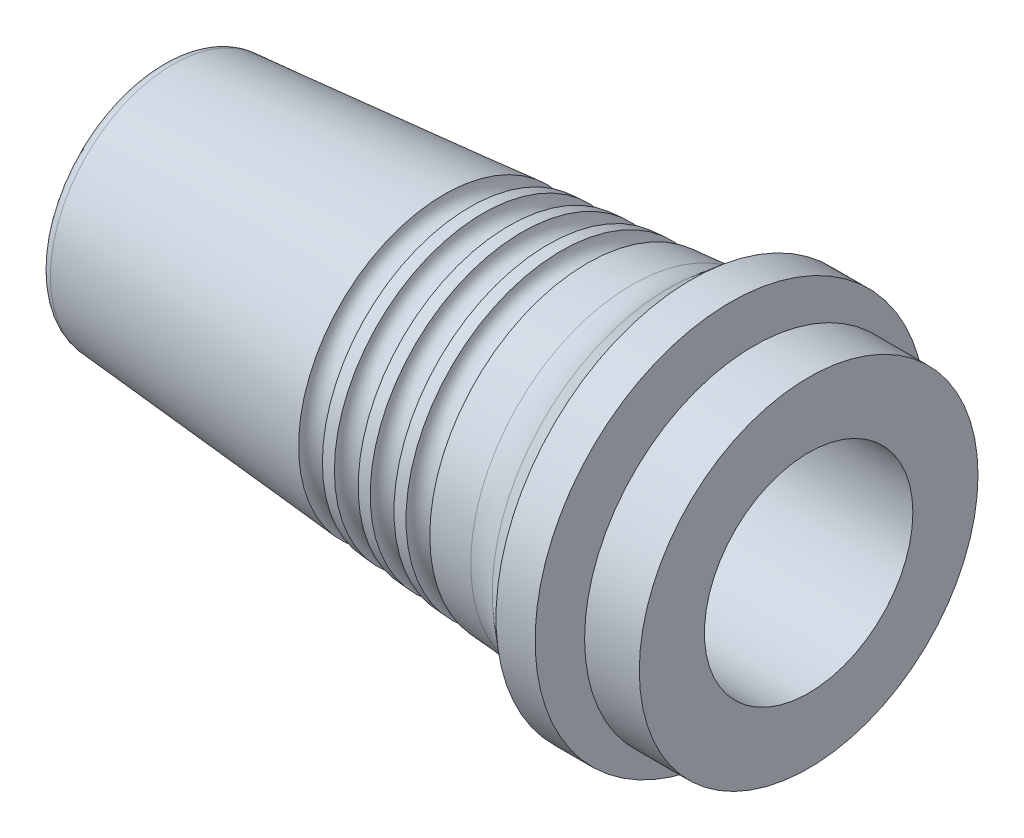
ISO-10303-21;
HEADER;
FILE_DESCRIPTION(('STEP AP214'),'2;1');
FILE_NAME('part.step','',(''),(''),'','','');
FILE_SCHEMA(('AUTOMOTIVE_DESIGN { 1 0 10303 214 1 1 1 1 }'));
ENDSEC;
DATA;
#1=APPLICATION_CONTEXT('core data for automotive mechanical design processes');
#2=APPLICATION_PROTOCOL_DEFINITION('international standard','automotive_design',2000,#1);
#3=PRODUCT_CONTEXT('',#1,'mechanical');
#4=PRODUCT('Part','Part','',(#3));
#5=PRODUCT_RELATED_PRODUCT_CATEGORY('part','',(#4));
#6=PRODUCT_DEFINITION_FORMATION('','',#4);
#7=PRODUCT_DEFINITION_CONTEXT('part definition',#1,'design');
#8=PRODUCT_DEFINITION('design','',#6,#7);
#9=PRODUCT_DEFINITION_SHAPE('','',#8);
#10=(LENGTH_UNIT() NAMED_UNIT(*) SI_UNIT(.MILLI.,.METRE.));
#11=(NAMED_UNIT(*) PLANE_ANGLE_UNIT() SI_UNIT($,.RADIAN.));
#12=(NAMED_UNIT(*) SI_UNIT($,.STERADIAN.) SOLID_ANGLE_UNIT());
#13=UNCERTAINTY_MEASURE_WITH_UNIT(LENGTH_MEASURE(1.E-05),#10,'distance_accuracy_value','');
#14=(GEOMETRIC_REPRESENTATION_CONTEXT(3) GLOBAL_UNCERTAINTY_ASSIGNED_CONTEXT((#13)) GLOBAL_UNIT_ASSIGNED_CONTEXT((#10,
#11,#12)) REPRESENTATION_CONTEXT('',''));
#15=CARTESIAN_POINT('',(0.,0.,0.));
#16=DIRECTION('',(0.,0.,1.));
#17=DIRECTION('',(1.,0.,0.));
#18=AXIS2_PLACEMENT_3D('',#15,#16,#17);
#19=CARTESIAN_POINT('',(-24.3783295478221,0.,0.));
#20=DIRECTION('',(1.,0.,0.));
#21=DIRECTION('',(0.,0.,-1.));
#22=AXIS2_PLACEMENT_3D('',#19,#20,#21);
#23=CONICAL_SURFACE('',#22,9.36511019661009,1.14346128624966);
#24=CARTESIAN_POINT('',(-24.6211020479349,0.,0.));
#25=DIRECTION('',(-1.,0.,0.));
#26=DIRECTION('',(0.,0.,1.));
#27=AXIS2_PLACEMENT_3D('',#24,#25,#26);
#28=CIRCLE('',#27,8.83201229208599);
#29=CARTESIAN_POINT('',(-24.6211020479349,0.,8.83201229208599));
#30=VERTEX_POINT('',#29);
#31=EDGE_CURVE('E48',#30,#30,#28,.T.);
#32=ORIENTED_EDGE('',*,*,#31,.T.);
#33=EDGE_LOOP('',(#32));
#34=FACE_BOUND('',#33,.T.);
#35=CARTESIAN_POINT('',(-25.,0.,0.));
#36=DIRECTION('',(1.,0.,0.));
#37=DIRECTION('',(0.,0.,-1.));
#38=AXIS2_PLACEMENT_3D('',#35,#36,#37);
#39=CIRCLE('',#38,7.99999999999999);
#40=CARTESIAN_POINT('',(-25.,0.,-7.99999999999999));
#41=VERTEX_POINT('',#40);
#42=EDGE_CURVE('E57',#41,#41,#39,.T.);
#43=ORIENTED_EDGE('',*,*,#42,.T.);
#44=EDGE_LOOP('',(#43));
#45=FACE_BOUND('',#44,.T.);
#46=ADVANCED_FACE('F37',(#34,#45),#23,.T.);
#47=CARTESIAN_POINT('',(44.8671328671328,0.,0.));
#48=DIRECTION('',(1.,0.,0.));
#49=DIRECTION('',(0.,0.,-1.));
#50=AXIS2_PLACEMENT_3D('',#47,#48,#49);
#51=CYLINDRICAL_SURFACE('',#50,7.99999999999999);
#52=CARTESIAN_POINT('',(25.,0.,0.));
#53=DIRECTION('',(1.,0.,0.));
#54=DIRECTION('',(0.,0.,-1.));
#55=AXIS2_PLACEMENT_3D('',#52,#53,#54);
#56=CIRCLE('',#55,8.);
#57=CARTESIAN_POINT('',(25.,0.,-8.));
#58=VERTEX_POINT('',#57);
#59=EDGE_CURVE('E60',#58,#58,#56,.T.);
#60=ORIENTED_EDGE('',*,*,#59,.T.);
#61=EDGE_LOOP('',(#60));
#62=FACE_BOUND('',#61,.T.);
#63=ORIENTED_EDGE('',*,*,#42,.F.);
#64=EDGE_LOOP('',(#63));
#65=FACE_BOUND('',#64,.T.);
#66=ADVANCED_FACE('F122',(#62,#65),#51,.F.);
#67=CARTESIAN_POINT('',(25.,13.,0.));
#68=DIRECTION('',(1.,0.,0.));
#69=DIRECTION('',(0.,0.,-1.));
#70=AXIS2_PLACEMENT_3D('',#67,#68,#69);
#71=PLANE('',#70);
#72=CARTESIAN_POINT('',(25.,0.,0.));
#73=DIRECTION('',(1.,0.,0.));
#74=DIRECTION('',(0.,0.,-1.));
#75=AXIS2_PLACEMENT_3D('',#72,#73,#74);
#76=CIRCLE('',#75,13.);
#77=CARTESIAN_POINT('',(25.,0.,-13.));
#78=VERTEX_POINT('',#77);
#79=EDGE_CURVE('E63',#78,#78,#76,.T.);
#80=ORIENTED_EDGE('',*,*,#79,.T.);
#81=EDGE_LOOP('',(#80));
#82=FACE_BOUND('',#81,.T.);
#83=ORIENTED_EDGE('',*,*,#59,.F.);
#84=EDGE_LOOP('',(#83));
#85=FACE_BOUND('',#84,.T.);
#86=ADVANCED_FACE('F128',(#82,#85),#71,.T.);
#87=CARTESIAN_POINT('',(44.8671328671328,0.,0.));
#88=DIRECTION('',(1.,0.,0.));
#89=DIRECTION('',(0.,0.,-1.));
#90=AXIS2_PLACEMENT_3D('',#87,#88,#89);
#91=CYLINDRICAL_SURFACE('',#90,13.);
#92=CARTESIAN_POINT('',(20.8,0.,0.));
#93=DIRECTION('',(1.,0.,0.));
#94=DIRECTION('',(0.,0.,-1.));
#95=AXIS2_PLACEMENT_3D('',#92,#93,#94);
#96=CIRCLE('',#95,13.);
#97=CARTESIAN_POINT('',(20.8,0.,-13.));
#98=VERTEX_POINT('',#97);
#99=EDGE_CURVE('E66',#98,#98,#96,.T.);
#100=ORIENTED_EDGE('',*,*,#99,.T.);
#101=EDGE_LOOP('',(#100));
#102=FACE_BOUND('',#101,.T.);
#103=ORIENTED_EDGE('',*,*,#79,.F.);
#104=EDGE_LOOP('',(#103));
#105=FACE_BOUND('',#104,.T.);
#106=ADVANCED_FACE('F135',(#102,#105),#91,.T.);
#107=CARTESIAN_POINT('',(20.8,10.,0.));
#108=DIRECTION('',(-1.,0.,0.));
#109=DIRECTION('',(0.,0.,1.));
#110=AXIS2_PLACEMENT_3D('',#107,#108,#109);
#111=PLANE('',#110);
#112=CARTESIAN_POINT('',(20.8,0.,0.));
#113=DIRECTION('',(1.,0.,0.));
#114=DIRECTION('',(0.,0.,-1.));
#115=AXIS2_PLACEMENT_3D('',#112,#113,#114);
#116=CIRCLE('',#115,10.);
#117=CARTESIAN_POINT('',(20.8,0.,-10.));
#118=VERTEX_POINT('',#117);
#119=EDGE_CURVE('E69',#118,#118,#116,.T.);
#120=ORIENTED_EDGE('',*,*,#119,.T.);
#121=EDGE_LOOP('',(#120));
#122=FACE_BOUND('',#121,.T.);
#123=ORIENTED_EDGE('',*,*,#99,.F.);
#124=EDGE_LOOP('',(#123));
#125=FACE_BOUND('',#124,.T.);
#126=ADVANCED_FACE('F139',(#122,#125),#111,.T.);
#127=CARTESIAN_POINT('',(44.8671328671328,0.,0.));
#128=DIRECTION('',(1.,0.,0.));
#129=DIRECTION('',(0.,0.,-1.));
#130=AXIS2_PLACEMENT_3D('',#127,#128,#129);
#131=CYLINDRICAL_SURFACE('',#130,10.);
#132=CARTESIAN_POINT('',(19.,0.,0.));
#133=DIRECTION('',(1.,0.,0.));
#134=DIRECTION('',(0.,0.,-1.));
#135=AXIS2_PLACEMENT_3D('',#132,#133,#134);
#136=CIRCLE('',#135,10.);
#137=CARTESIAN_POINT('',(19.,0.,-10.));
#138=VERTEX_POINT('',#137);
#139=EDGE_CURVE('E72',#138,#138,#136,.T.);
#140=ORIENTED_EDGE('',*,*,#139,.T.);
#141=EDGE_LOOP('',(#140));
#142=FACE_BOUND('',#141,.T.);
#143=ORIENTED_EDGE('',*,*,#119,.F.);
#144=EDGE_LOOP('',(#143));
#145=FACE_BOUND('',#144,.T.);
#146=ADVANCED_FACE('F143',(#142,#145),#131,.T.);
#147=CARTESIAN_POINT('',(19.,15.,0.));
#148=DIRECTION('',(1.,0.,0.));
#149=DIRECTION('',(0.,0.,-1.));
#150=AXIS2_PLACEMENT_3D('',#147,#148,#149);
#151=PLANE('',#150);
#152=CARTESIAN_POINT('',(19.,0.,0.));
#153=DIRECTION('',(1.,0.,0.));
#154=DIRECTION('',(0.,0.,-1.));
#155=AXIS2_PLACEMENT_3D('',#152,#153,#154);
#156=CIRCLE('',#155,15.);
#157=CARTESIAN_POINT('',(19.,0.,-15.));
#158=VERTEX_POINT('',#157);
#159=EDGE_CURVE('E75',#158,#158,#156,.T.);
#160=ORIENTED_EDGE('',*,*,#159,.T.);
#161=EDGE_LOOP('',(#160));
#162=FACE_BOUND('',#161,.T.);
#163=ORIENTED_EDGE('',*,*,#139,.F.);
#164=EDGE_LOOP('',(#163));
#165=FACE_BOUND('',#164,.T.);
#166=ADVANCED_FACE('F147',(#162,#165),#151,.T.);
#167=CARTESIAN_POINT('',(44.8671328671328,0.,0.));
#168=DIRECTION('',(1.,0.,0.));
#169=DIRECTION('',(0.,0.,-1.));
#170=AXIS2_PLACEMENT_3D('',#167,#168,#169);
#171=CYLINDRICAL_SURFACE('',#170,15.);
#172=CARTESIAN_POINT('',(16.,0.,0.));
#173=DIRECTION('',(1.,0.,0.));
#174=DIRECTION('',(0.,0.,-1.));
#175=AXIS2_PLACEMENT_3D('',#172,#173,#174);
#176=CIRCLE('',#175,15.);
#177=CARTESIAN_POINT('',(16.,0.,-15.));
#178=VERTEX_POINT('',#177);
#179=EDGE_CURVE('E78',#178,#178,#176,.T.);
#180=ORIENTED_EDGE('',*,*,#179,.T.);
#181=EDGE_LOOP('',(#180));
#182=FACE_BOUND('',#181,.T.);
#183=ORIENTED_EDGE('',*,*,#159,.F.);
#184=EDGE_LOOP('',(#183));
#185=FACE_BOUND('',#184,.T.);
#186=ADVANCED_FACE('F151',(#182,#185),#171,.T.);
#187=CARTESIAN_POINT('',(16.,0.,0.));
#188=DIRECTION('',(1.,0.,0.));
#189=DIRECTION('',(0.,0.,-1.));
#190=AXIS2_PLACEMENT_3D('',#187,#188,#189);
#191=CONICAL_SURFACE('',#190,15.,0.694738276196703);
#192=CARTESIAN_POINT('',(14.211517828766,0.,0.));
#193=DIRECTION('',(1.,0.,0.));
#194=DIRECTION('',(0.,0.,-1.));
#195=AXIS2_PLACEMENT_3D('',#192,#193,#194);
#196=CIRCLE('',#195,13.5095981906383);
#197=CARTESIAN_POINT('',(14.211517828766,0.,-13.5095981906383));
#198=VERTEX_POINT('',#197);
#199=EDGE_CURVE('E44',#198,#198,#196,.T.);
#200=ORIENTED_EDGE('',*,*,#199,.T.);
#201=EDGE_LOOP('',(#200));
#202=FACE_BOUND('',#201,.T.);
#203=ORIENTED_EDGE('',*,*,#179,.F.);
#204=EDGE_LOOP('',(#203));
#205=FACE_BOUND('',#204,.T.);
#206=ADVANCED_FACE('F155',(#202,#205),#191,.T.);
#207=CARTESIAN_POINT('',(13.,0.,0.));
#208=DIRECTION('',(1.,0.,0.));
#209=DIRECTION('',(0.,0.,-1.));
#210=AXIS2_PLACEMENT_3D('',#207,#208,#209);
#211=CONICAL_SURFACE('',#210,12.5,0.0836733582026755);
#212=CARTESIAN_POINT('',(11.4284746119061,0.,0.));
#213=DIRECTION('',(1.,0.,0.));
#214=DIRECTION('',(0.,0.,-1.));
#215=AXIS2_PLACEMENT_3D('',#212,#213,#214);
#216=CIRCLE('',#215,12.3681974562667);
#217=CARTESIAN_POINT('',(11.4284746119061,0.,-12.3681974562667));
#218=VERTEX_POINT('',#217);
#219=EDGE_CURVE('E10',#218,#218,#216,.F.);
#220=ORIENTED_EDGE('',*,*,#219,.T.);
#221=EDGE_LOOP('',(#220));
#222=FACE_BOUND('',#221,.T.);
#223=CARTESIAN_POINT('',(7.9965014264717,0.,0.));
#224=DIRECTION('',(1.,0.,0.));
#225=DIRECTION('',(0.,0.,-1.));
#226=AXIS2_PLACEMENT_3D('',#223,#224,#225);
#227=CIRCLE('',#226,12.0803606836051);
#228=CARTESIAN_POINT('',(7.9965014264717,0.,-12.0803606836051));
#229=VERTEX_POINT('',#228);
#230=EDGE_CURVE('E81',#229,#229,#227,.T.);
#231=ORIENTED_EDGE('',*,*,#230,.T.);
#232=EDGE_LOOP('',(#231));
#233=FACE_BOUND('',#232,.T.);
#234=ADVANCED_FACE('F159',(#222,#233),#211,.T.);
#235=CARTESIAN_POINT('',(7.,0.,0.));
#236=DIRECTION('',(1.,0.,0.));
#237=DIRECTION('',(0.,0.,-1.));
#238=AXIS2_PLACEMENT_3D('',#235,#236,#237);
#239=TOROIDAL_SURFACE('',#238,11.9967849273126,1.);
#240=CARTESIAN_POINT('',(6.0034985735283,0.,0.));
#241=DIRECTION('',(1.,0.,0.));
#242=DIRECTION('',(0.,0.,-1.));
#243=AXIS2_PLACEMENT_3D('',#240,#241,#242);
#244=CIRCLE('',#243,11.9132091710201);
#245=CARTESIAN_POINT('',(6.0034985735283,0.,-11.9132091710201));
#246=VERTEX_POINT('',#245);
#247=EDGE_CURVE('E84',#246,#246,#244,.T.);
#248=ORIENTED_EDGE('',*,*,#247,.T.);
#249=EDGE_LOOP('',(#248));
#250=FACE_BOUND('',#249,.T.);
#251=ORIENTED_EDGE('',*,*,#230,.F.);
#252=EDGE_LOOP('',(#251));
#253=FACE_BOUND('',#252,.T.);
#254=ADVANCED_FACE('F162',(#250,#253),#239,.F.);
#255=CARTESIAN_POINT('',(6.0034985735283,0.,0.));
#256=DIRECTION('',(1.,0.,0.));
#257=DIRECTION('',(0.,0.,-1.));
#258=AXIS2_PLACEMENT_3D('',#255,#256,#257);
#259=CONICAL_SURFACE('',#258,11.9132091710201,0.0836733582026758);
#260=CARTESIAN_POINT('',(4.99650142647171,0.,0.));
#261=DIRECTION('',(1.,0.,0.));
#262=DIRECTION('',(0.,0.,-1.));
#263=AXIS2_PLACEMENT_3D('',#260,#261,#262);
#264=CIRCLE('',#263,11.8287531472615);
#265=CARTESIAN_POINT('',(4.99650142647171,0.,-11.8287531472615));
#266=VERTEX_POINT('',#265);
#267=EDGE_CURVE('E87',#266,#266,#264,.T.);
#268=ORIENTED_EDGE('',*,*,#267,.T.);
#269=EDGE_LOOP('',(#268));
#270=FACE_BOUND('',#269,.T.);
#271=ORIENTED_EDGE('',*,*,#247,.F.);
#272=EDGE_LOOP('',(#271));
#273=FACE_BOUND('',#272,.T.);
#274=ADVANCED_FACE('F165',(#270,#273),#259,.T.);
#275=CARTESIAN_POINT('',(4.,0.,0.));
#276=DIRECTION('',(1.,0.,0.));
#277=DIRECTION('',(0.,0.,-1.));
#278=AXIS2_PLACEMENT_3D('',#275,#276,#277);
#279=TOROIDAL_SURFACE('',#278,11.745177390969,1.);
#280=CARTESIAN_POINT('',(3.0034985735283,0.,0.));
#281=DIRECTION('',(1.,0.,0.));
#282=DIRECTION('',(0.,0.,-1.));
#283=AXIS2_PLACEMENT_3D('',#280,#281,#282);
#284=CIRCLE('',#283,11.6616016346765);
#285=CARTESIAN_POINT('',(3.0034985735283,0.,-11.6616016346765));
#286=VERTEX_POINT('',#285);
#287=EDGE_CURVE('E90',#286,#286,#284,.T.);
#288=ORIENTED_EDGE('',*,*,#287,.T.);
#289=EDGE_LOOP('',(#288));
#290=FACE_BOUND('',#289,.T.);
#291=ORIENTED_EDGE('',*,*,#267,.F.);
#292=EDGE_LOOP('',(#291));
#293=FACE_BOUND('',#292,.T.);
#294=ADVANCED_FACE('F169',(#290,#293),#279,.F.);
#295=CARTESIAN_POINT('',(3.0034985735283,0.,0.));
#296=DIRECTION('',(1.,0.,0.));
#297=DIRECTION('',(0.,0.,-1.));
#298=AXIS2_PLACEMENT_3D('',#295,#296,#297);
#299=CONICAL_SURFACE('',#298,11.6616016346765,0.0836733582026786);
#300=CARTESIAN_POINT('',(1.9965014264717,0.,0.));
#301=DIRECTION('',(1.,0.,0.));
#302=DIRECTION('',(0.,0.,-1.));
#303=AXIS2_PLACEMENT_3D('',#300,#301,#302);
#304=CIRCLE('',#303,11.5771456109178);
#305=CARTESIAN_POINT('',(1.9965014264717,0.,-11.5771456109178));
#306=VERTEX_POINT('',#305);
#307=EDGE_CURVE('E93',#306,#306,#304,.T.);
#308=ORIENTED_EDGE('',*,*,#307,.T.);
#309=EDGE_LOOP('',(#308));
#310=FACE_BOUND('',#309,.T.);
#311=ORIENTED_EDGE('',*,*,#287,.F.);
#312=EDGE_LOOP('',(#311));
#313=FACE_BOUND('',#312,.T.);
#314=ADVANCED_FACE('F173',(#310,#313),#299,.T.);
#315=CARTESIAN_POINT('',(1.,0.,0.));
#316=DIRECTION('',(1.,0.,0.));
#317=DIRECTION('',(0.,0.,-1.));
#318=AXIS2_PLACEMENT_3D('',#315,#316,#317);
#319=TOROIDAL_SURFACE('',#318,11.4935698546253,1.);
#320=CARTESIAN_POINT('',(0.00349857352829885,0.,0.));
#321=DIRECTION('',(1.,0.,0.));
#322=DIRECTION('',(0.,0.,-1.));
#323=AXIS2_PLACEMENT_3D('',#320,#321,#322);
#324=CIRCLE('',#323,11.4099940983328);
#325=CARTESIAN_POINT('',(0.00349857352829885,0.,-11.4099940983328));
#326=VERTEX_POINT('',#325);
#327=EDGE_CURVE('E96',#326,#326,#324,.T.);
#328=ORIENTED_EDGE('',*,*,#327,.T.);
#329=EDGE_LOOP('',(#328));
#330=FACE_BOUND('',#329,.T.);
#331=ORIENTED_EDGE('',*,*,#307,.F.);
#332=EDGE_LOOP('',(#331));
#333=FACE_BOUND('',#332,.T.);
#334=ADVANCED_FACE('F177',(#330,#333),#319,.F.);
#335=CARTESIAN_POINT('',(0.00349857352829885,0.,0.));
#336=DIRECTION('',(1.,0.,0.));
#337=DIRECTION('',(0.,0.,-1.));
#338=AXIS2_PLACEMENT_3D('',#335,#336,#337);
#339=CONICAL_SURFACE('',#338,11.4099940983328,0.0836733582026752);
#340=CARTESIAN_POINT('',(-1.0034985735283,0.,0.));
#341=DIRECTION('',(1.,0.,0.));
#342=DIRECTION('',(0.,0.,-1.));
#343=AXIS2_PLACEMENT_3D('',#340,#341,#342);
#344=CIRCLE('',#343,11.3255380745741);
#345=CARTESIAN_POINT('',(-1.0034985735283,0.,-11.3255380745741));
#346=VERTEX_POINT('',#345);
#347=EDGE_CURVE('E99',#346,#346,#344,.T.);
#348=ORIENTED_EDGE('',*,*,#347,.T.);
#349=EDGE_LOOP('',(#348));
#350=FACE_BOUND('',#349,.T.);
#351=ORIENTED_EDGE('',*,*,#327,.F.);
#352=EDGE_LOOP('',(#351));
#353=FACE_BOUND('',#352,.T.);
#354=ADVANCED_FACE('F119',(#350,#353),#339,.T.);
#355=CARTESIAN_POINT('',(-2.,0.,0.));
#356=DIRECTION('',(1.,0.,0.));
#357=DIRECTION('',(0.,0.,-1.));
#358=AXIS2_PLACEMENT_3D('',#355,#356,#357);
#359=TOROIDAL_SURFACE('',#358,11.2419623182816,1.);
#360=CARTESIAN_POINT('',(-2.9965014264717,0.,0.));
#361=DIRECTION('',(1.,0.,0.));
#362=DIRECTION('',(0.,0.,-1.));
#363=AXIS2_PLACEMENT_3D('',#360,#361,#362);
#364=CIRCLE('',#363,11.1583865619891);
#365=CARTESIAN_POINT('',(-2.9965014264717,0.,-11.1583865619891));
#366=VERTEX_POINT('',#365);
#367=EDGE_CURVE('E102',#366,#366,#364,.T.);
#368=ORIENTED_EDGE('',*,*,#367,.T.);
#369=EDGE_LOOP('',(#368));
#370=FACE_BOUND('',#369,.T.);
#371=ORIENTED_EDGE('',*,*,#347,.F.);
#372=EDGE_LOOP('',(#371));
#373=FACE_BOUND('',#372,.T.);
#374=ADVANCED_FACE('F106',(#370,#373),#359,.F.);
#375=CARTESIAN_POINT('',(-2.9965014264717,0.,0.));
#376=DIRECTION('',(1.,0.,0.));
#377=DIRECTION('',(0.,0.,-1.));
#378=AXIS2_PLACEMENT_3D('',#375,#376,#377);
#379=CONICAL_SURFACE('',#378,11.1583865619891,0.0836733582026767);
#380=CARTESIAN_POINT('',(-23.7946043398207,0.,0.));
#381=DIRECTION('',(-1.,0.,0.));
#382=DIRECTION('',(0.,0.,1.));
#383=AXIS2_PLACEMENT_3D('',#380,#381,#382);
#384=CIRCLE('',#383,9.41406675043907);
#385=CARTESIAN_POINT('',(-23.7946043398207,0.,9.41406675043907));
#386=VERTEX_POINT('',#385);
#387=EDGE_CURVE('E52',#386,#386,#384,.F.);
#388=ORIENTED_EDGE('',*,*,#387,.T.);
#389=EDGE_LOOP('',(#388));
#390=FACE_BOUND('',#389,.T.);
#391=ORIENTED_EDGE('',*,*,#367,.F.);
#392=EDGE_LOOP('',(#391));
#393=FACE_BOUND('',#392,.T.);
#394=ADVANCED_FACE('F109',(#390,#393),#379,.T.);
#395=CARTESIAN_POINT('',(-23.7110285835282,0.,0.));
#396=DIRECTION('',(-1.,0.,0.));
#397=DIRECTION('',(0.,0.,1.));
#398=AXIS2_PLACEMENT_3D('',#395,#396,#397);
#399=TOROIDAL_SURFACE('',#398,8.41756532396736,1.);
#400=ORIENTED_EDGE('',*,*,#31,.F.);
#401=EDGE_LOOP('',(#400));
#402=FACE_BOUND('',#401,.T.);
#403=ORIENTED_EDGE('',*,*,#387,.F.);
#404=EDGE_LOOP('',(#403));
#405=FACE_BOUND('',#404,.T.);
#406=ADVANCED_FACE('F111',(#402,#405),#399,.T.);
#407=CARTESIAN_POINT('',(11.0105958304436,0.,0.));
#408=DIRECTION('',(1.,0.,0.));
#409=DIRECTION('',(0.,0.,-1.));
#410=AXIS2_PLACEMENT_3D('',#407,#408,#409);
#411=TOROIDAL_SURFACE('',#410,17.3507045886252,5.);
#412=ORIENTED_EDGE('',*,*,#219,.F.);
#413=EDGE_LOOP('',(#412));
#414=FACE_BOUND('',#413,.T.);
#415=ORIENTED_EDGE('',*,*,#199,.F.);
#416=EDGE_LOOP('',(#415));
#417=FACE_BOUND('',#416,.T.);
#418=ADVANCED_FACE('F39',(#414,#417),#411,.F.);
#419=CLOSED_SHELL('',(#46,#66,#86,#106,#126,#146,#166,#186,#206,#234,#254,#274,#294,#314,#334,
#354,#374,#394,#406,#418));
#420=MANIFOLD_SOLID_BREP('B2',#419);
#421=ADVANCED_BREP_SHAPE_REPRESENTATION('',(#18,#420),#14);
#422=SHAPE_DEFINITION_REPRESENTATION(#9,#421);
ENDSEC;
END-ISO-10303-21;
